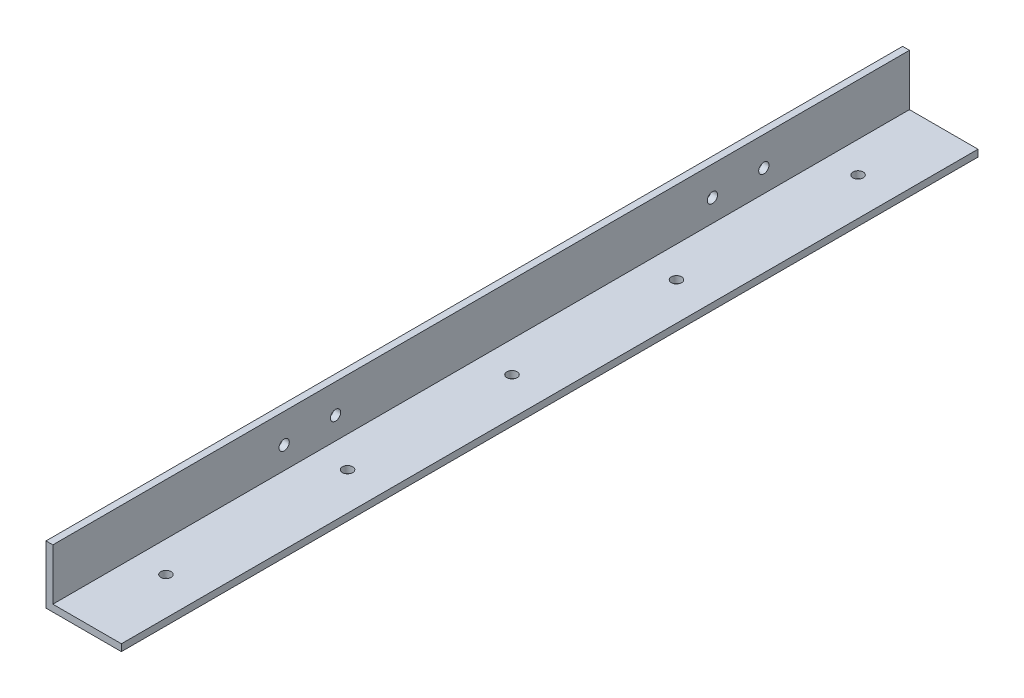
ISO-10303-21;
HEADER;
FILE_DESCRIPTION(('STEP AP214'),'2;1');
FILE_NAME('part.step','',(''),(''),'','','');
FILE_SCHEMA(('AUTOMOTIVE_DESIGN { 1 0 10303 214 1 1 1 1 }'));
ENDSEC;
DATA;
#1=APPLICATION_CONTEXT('core data for automotive mechanical design processes');
#2=APPLICATION_PROTOCOL_DEFINITION('international standard','automotive_design',2000,#1);
#3=PRODUCT_CONTEXT('',#1,'mechanical');
#4=PRODUCT('Part','Part','',(#3));
#5=PRODUCT_RELATED_PRODUCT_CATEGORY('part','',(#4));
#6=PRODUCT_DEFINITION_FORMATION('','',#4);
#7=PRODUCT_DEFINITION_CONTEXT('part definition',#1,'design');
#8=PRODUCT_DEFINITION('design','',#6,#7);
#9=PRODUCT_DEFINITION_SHAPE('','',#8);
#10=(LENGTH_UNIT() NAMED_UNIT(*) SI_UNIT(.MILLI.,.METRE.));
#11=(NAMED_UNIT(*) PLANE_ANGLE_UNIT() SI_UNIT($,.RADIAN.));
#12=(NAMED_UNIT(*) SI_UNIT($,.STERADIAN.) SOLID_ANGLE_UNIT());
#13=UNCERTAINTY_MEASURE_WITH_UNIT(LENGTH_MEASURE(1.E-05),#10,'distance_accuracy_value','');
#14=(GEOMETRIC_REPRESENTATION_CONTEXT(3) GLOBAL_UNCERTAINTY_ASSIGNED_CONTEXT((#13)) GLOBAL_UNIT_ASSIGNED_CONTEXT((#10,
#11,#12)) REPRESENTATION_CONTEXT('',''));
#15=CARTESIAN_POINT('',(0.,0.,0.));
#16=DIRECTION('',(0.,0.,1.));
#17=DIRECTION('',(1.,0.,0.));
#18=AXIS2_PLACEMENT_3D('',#15,#16,#17);
#19=CARTESIAN_POINT('',(0.,0.,-250.));
#20=DIRECTION('',(0.,-1.,0.));
#21=DIRECTION('',(0.,0.,-1.));
#22=AXIS2_PLACEMENT_3D('',#19,#20,#21);
#23=PLANE('',#22);
#24=CARTESIAN_POINT('',(11.,0.,-226.));
#25=DIRECTION('',(0.,-1.,0.));
#26=DIRECTION('',(0.,0.,-1.));
#27=AXIS2_PLACEMENT_3D('',#24,#25,#26);
#28=CIRCLE('',#27,1.5);
#29=CARTESIAN_POINT('',(11.,0.,-227.5));
#30=VERTEX_POINT('',#29);
#31=EDGE_CURVE('E132',#30,#30,#28,.T.);
#32=ORIENTED_EDGE('',*,*,#31,.F.);
#33=EDGE_LOOP('',(#32));
#34=FACE_BOUND('',#33,.T.);
#35=CARTESIAN_POINT('',(11.,0.,-77.));
#36=DIRECTION('',(0.,-1.,0.));
#37=DIRECTION('',(0.,0.,-1.));
#38=AXIS2_PLACEMENT_3D('',#35,#36,#37);
#39=CIRCLE('',#38,1.5);
#40=CARTESIAN_POINT('',(11.,0.,-78.5));
#41=VERTEX_POINT('',#40);
#42=EDGE_CURVE('E189',#41,#41,#39,.T.);
#43=ORIENTED_EDGE('',*,*,#42,.F.);
#44=EDGE_LOOP('',(#43));
#45=FACE_BOUND('',#44,.T.);
#46=CARTESIAN_POINT('',(11.,0.,-173.));
#47=DIRECTION('',(0.,-1.,0.));
#48=DIRECTION('',(0.,0.,-1.));
#49=AXIS2_PLACEMENT_3D('',#46,#47,#48);
#50=CIRCLE('',#49,1.5);
#51=CARTESIAN_POINT('',(11.,0.,-174.5));
#52=VERTEX_POINT('',#51);
#53=EDGE_CURVE('E186',#52,#52,#50,.T.);
#54=ORIENTED_EDGE('',*,*,#53,.F.);
#55=EDGE_LOOP('',(#54));
#56=FACE_BOUND('',#55,.T.);
#57=CARTESIAN_POINT('',(11.,0.,-125.));
#58=DIRECTION('',(0.,-1.,0.));
#59=DIRECTION('',(0.,0.,-1.));
#60=AXIS2_PLACEMENT_3D('',#57,#58,#59);
#61=CIRCLE('',#60,1.5);
#62=CARTESIAN_POINT('',(11.,0.,-126.5));
#63=VERTEX_POINT('',#62);
#64=EDGE_CURVE('E183',#63,#63,#61,.T.);
#65=ORIENTED_EDGE('',*,*,#64,.F.);
#66=EDGE_LOOP('',(#65));
#67=FACE_BOUND('',#66,.T.);
#68=CARTESIAN_POINT('',(11.,0.,-24.));
#69=DIRECTION('',(0.,-1.,0.));
#70=DIRECTION('',(0.,0.,-1.));
#71=AXIS2_PLACEMENT_3D('',#68,#69,#70);
#72=CIRCLE('',#71,1.5);
#73=CARTESIAN_POINT('',(11.,0.,-25.5));
#74=VERTEX_POINT('',#73);
#75=EDGE_CURVE('E180',#74,#74,#72,.T.);
#76=ORIENTED_EDGE('',*,*,#75,.F.);
#77=EDGE_LOOP('',(#76));
#78=FACE_BOUND('',#77,.T.);
#79=DIRECTION('',(1.,0.,0.));
#80=VECTOR('',#79,1.);
#81=CARTESIAN_POINT('',(0.,0.,0.));
#82=LINE('',#81,#80);
#83=CARTESIAN_POINT('',(0.,0.,0.));
#84=VERTEX_POINT('',#83);
#85=CARTESIAN_POINT('',(22.,0.,0.));
#86=VERTEX_POINT('',#85);
#87=EDGE_CURVE('E128',#84,#86,#82,.T.);
#88=ORIENTED_EDGE('',*,*,#87,.F.);
#89=DIRECTION('',(0.,0.,1.));
#90=VECTOR('',#89,1.);
#91=CARTESIAN_POINT('',(0.,0.,-250.));
#92=LINE('',#91,#90);
#93=CARTESIAN_POINT('',(0.,0.,-250.));
#94=VERTEX_POINT('',#93);
#95=EDGE_CURVE('E11',#94,#84,#92,.T.);
#96=ORIENTED_EDGE('',*,*,#95,.F.);
#97=DIRECTION('',(1.,0.,0.));
#98=VECTOR('',#97,1.);
#99=CARTESIAN_POINT('',(0.,0.,-250.));
#100=LINE('',#99,#98);
#101=CARTESIAN_POINT('',(22.,0.,-250.));
#102=VERTEX_POINT('',#101);
#103=EDGE_CURVE('E143',#94,#102,#100,.T.);
#104=ORIENTED_EDGE('',*,*,#103,.T.);
#105=DIRECTION('',(0.,0.,1.));
#106=VECTOR('',#105,1.);
#107=CARTESIAN_POINT('',(22.,0.,-250.));
#108=LINE('',#107,#106);
#109=EDGE_CURVE('E92',#102,#86,#108,.T.);
#110=ORIENTED_EDGE('',*,*,#109,.T.);
#111=EDGE_LOOP('',(#88,#96,#104,#110));
#112=FACE_BOUND('',#111,.T.);
#113=ADVANCED_FACE('F42',(#34,#45,#56,#67,#78,#112),#23,.T.);
#114=CARTESIAN_POINT('',(0.,0.,-250.));
#115=DIRECTION('',(-1.,0.,0.));
#116=DIRECTION('',(0.,0.,1.));
#117=AXIS2_PLACEMENT_3D('',#114,#115,#116);
#118=PLANE('',#117);
#119=CARTESIAN_POINT('',(0.,8.5,-207.5));
#120=DIRECTION('',(-1.,0.,0.));
#121=DIRECTION('',(0.,0.,1.));
#122=AXIS2_PLACEMENT_3D('',#119,#120,#121);
#123=CIRCLE('',#122,1.5);
#124=CARTESIAN_POINT('',(0.,8.5,-206.));
#125=VERTEX_POINT('',#124);
#126=EDGE_CURVE('E154',#125,#125,#123,.T.);
#127=ORIENTED_EDGE('',*,*,#126,.F.);
#128=EDGE_LOOP('',(#127));
#129=FACE_BOUND('',#128,.T.);
#130=CARTESIAN_POINT('',(0.,8.5,-82.5));
#131=DIRECTION('',(-1.,0.,0.));
#132=DIRECTION('',(0.,0.,1.));
#133=AXIS2_PLACEMENT_3D('',#130,#131,#132);
#134=CIRCLE('',#133,1.5);
#135=CARTESIAN_POINT('',(0.,8.5,-81.));
#136=VERTEX_POINT('',#135);
#137=EDGE_CURVE('E270',#136,#136,#134,.T.);
#138=ORIENTED_EDGE('',*,*,#137,.F.);
#139=EDGE_LOOP('',(#138));
#140=FACE_BOUND('',#139,.T.);
#141=CARTESIAN_POINT('',(0.,8.5,-67.5));
#142=DIRECTION('',(-1.,0.,0.));
#143=DIRECTION('',(0.,0.,1.));
#144=AXIS2_PLACEMENT_3D('',#141,#142,#143);
#145=CIRCLE('',#144,1.5);
#146=CARTESIAN_POINT('',(0.,8.5,-66.));
#147=VERTEX_POINT('',#146);
#148=EDGE_CURVE('E267',#147,#147,#145,.T.);
#149=ORIENTED_EDGE('',*,*,#148,.F.);
#150=EDGE_LOOP('',(#149));
#151=FACE_BOUND('',#150,.T.);
#152=CARTESIAN_POINT('',(0.,8.5,-192.5));
#153=DIRECTION('',(-1.,0.,0.));
#154=DIRECTION('',(0.,0.,1.));
#155=AXIS2_PLACEMENT_3D('',#152,#153,#154);
#156=CIRCLE('',#155,1.5);
#157=CARTESIAN_POINT('',(0.,8.5,-191.));
#158=VERTEX_POINT('',#157);
#159=EDGE_CURVE('E264',#158,#158,#156,.T.);
#160=ORIENTED_EDGE('',*,*,#159,.F.);
#161=EDGE_LOOP('',(#160));
#162=FACE_BOUND('',#161,.T.);
#163=DIRECTION('',(0.,-1.,0.));
#164=VECTOR('',#163,1.);
#165=CARTESIAN_POINT('',(0.,0.,0.));
#166=LINE('',#165,#164);
#167=CARTESIAN_POINT('',(0.,17.,0.));
#168=VERTEX_POINT('',#167);
#169=EDGE_CURVE('E141',#168,#84,#166,.T.);
#170=ORIENTED_EDGE('',*,*,#169,.F.);
#171=DIRECTION('',(0.,0.,1.));
#172=VECTOR('',#171,1.);
#173=CARTESIAN_POINT('',(0.,17.,-250.));
#174=LINE('',#173,#172);
#175=CARTESIAN_POINT('',(0.,17.,-250.));
#176=VERTEX_POINT('',#175);
#177=EDGE_CURVE('E51',#176,#168,#174,.T.);
#178=ORIENTED_EDGE('',*,*,#177,.F.);
#179=DIRECTION('',(0.,-1.,0.));
#180=VECTOR('',#179,1.);
#181=CARTESIAN_POINT('',(0.,0.,-250.));
#182=LINE('',#181,#180);
#183=EDGE_CURVE('E118',#176,#94,#182,.T.);
#184=ORIENTED_EDGE('',*,*,#183,.T.);
#185=ORIENTED_EDGE('',*,*,#95,.T.);
#186=EDGE_LOOP('',(#170,#178,#184,#185));
#187=FACE_BOUND('',#186,.T.);
#188=ADVANCED_FACE('F198',(#129,#140,#151,#162,#187),#118,.T.);
#189=CARTESIAN_POINT('',(0.,17.,-250.));
#190=DIRECTION('',(0.,1.,0.));
#191=DIRECTION('',(0.,0.,1.));
#192=AXIS2_PLACEMENT_3D('',#189,#190,#191);
#193=PLANE('',#192);
#194=DIRECTION('',(-1.,0.,0.));
#195=VECTOR('',#194,1.);
#196=CARTESIAN_POINT('',(0.,17.,0.));
#197=LINE('',#196,#195);
#198=CARTESIAN_POINT('',(2.,17.,0.));
#199=VERTEX_POINT('',#198);
#200=EDGE_CURVE('E105',#199,#168,#197,.T.);
#201=ORIENTED_EDGE('',*,*,#200,.F.);
#202=DIRECTION('',(0.,0.,1.));
#203=VECTOR('',#202,1.);
#204=CARTESIAN_POINT('',(2.,17.,-250.));
#205=LINE('',#204,#203);
#206=CARTESIAN_POINT('',(2.,17.,-250.));
#207=VERTEX_POINT('',#206);
#208=EDGE_CURVE('E100',#207,#199,#205,.T.);
#209=ORIENTED_EDGE('',*,*,#208,.F.);
#210=DIRECTION('',(-1.,0.,0.));
#211=VECTOR('',#210,1.);
#212=CARTESIAN_POINT('',(0.,17.,-250.));
#213=LINE('',#212,#211);
#214=EDGE_CURVE('E103',#207,#176,#213,.T.);
#215=ORIENTED_EDGE('',*,*,#214,.T.);
#216=ORIENTED_EDGE('',*,*,#177,.T.);
#217=EDGE_LOOP('',(#201,#209,#215,#216));
#218=FACE_BOUND('',#217,.T.);
#219=ADVANCED_FACE('F102',(#218),#193,.T.);
#220=CARTESIAN_POINT('',(2.,17.,-250.));
#221=DIRECTION('',(1.,0.,0.));
#222=DIRECTION('',(0.,1.,0.));
#223=AXIS2_PLACEMENT_3D('',#220,#221,#222);
#224=PLANE('',#223);
#225=CARTESIAN_POINT('',(2.,8.5,-207.5));
#226=DIRECTION('',(1.,0.,0.));
#227=DIRECTION('',(0.,1.,0.));
#228=AXIS2_PLACEMENT_3D('',#225,#226,#227);
#229=CIRCLE('',#228,1.5);
#230=CARTESIAN_POINT('',(2.,10.,-207.5));
#231=VERTEX_POINT('',#230);
#232=EDGE_CURVE('E45',#231,#231,#229,.T.);
#233=ORIENTED_EDGE('',*,*,#232,.F.);
#234=EDGE_LOOP('',(#233));
#235=FACE_BOUND('',#234,.T.);
#236=CARTESIAN_POINT('',(2.,8.5,-82.5));
#237=DIRECTION('',(1.,0.,0.));
#238=DIRECTION('',(0.,1.,0.));
#239=AXIS2_PLACEMENT_3D('',#236,#237,#238);
#240=CIRCLE('',#239,1.5);
#241=CARTESIAN_POINT('',(2.,10.,-82.5));
#242=VERTEX_POINT('',#241);
#243=EDGE_CURVE('E156',#242,#242,#240,.T.);
#244=ORIENTED_EDGE('',*,*,#243,.F.);
#245=EDGE_LOOP('',(#244));
#246=FACE_BOUND('',#245,.T.);
#247=CARTESIAN_POINT('',(2.,8.5,-67.5));
#248=DIRECTION('',(1.,0.,0.));
#249=DIRECTION('',(0.,1.,0.));
#250=AXIS2_PLACEMENT_3D('',#247,#248,#249);
#251=CIRCLE('',#250,1.5);
#252=CARTESIAN_POINT('',(2.,10.,-67.5));
#253=VERTEX_POINT('',#252);
#254=EDGE_CURVE('E153',#253,#253,#251,.T.);
#255=ORIENTED_EDGE('',*,*,#254,.F.);
#256=EDGE_LOOP('',(#255));
#257=FACE_BOUND('',#256,.T.);
#258=CARTESIAN_POINT('',(2.,8.5,-192.5));
#259=DIRECTION('',(1.,0.,0.));
#260=DIRECTION('',(0.,1.,0.));
#261=AXIS2_PLACEMENT_3D('',#258,#259,#260);
#262=CIRCLE('',#261,1.5);
#263=CARTESIAN_POINT('',(2.,10.,-192.5));
#264=VERTEX_POINT('',#263);
#265=EDGE_CURVE('E150',#264,#264,#262,.T.);
#266=ORIENTED_EDGE('',*,*,#265,.F.);
#267=EDGE_LOOP('',(#266));
#268=FACE_BOUND('',#267,.T.);
#269=DIRECTION('',(0.,1.,0.));
#270=VECTOR('',#269,1.);
#271=CARTESIAN_POINT('',(2.,17.,0.));
#272=LINE('',#271,#270);
#273=CARTESIAN_POINT('',(2.,2.,0.));
#274=VERTEX_POINT('',#273);
#275=EDGE_CURVE('E138',#274,#199,#272,.T.);
#276=ORIENTED_EDGE('',*,*,#275,.F.);
#277=DIRECTION('',(0.,0.,1.));
#278=VECTOR('',#277,1.);
#279=CARTESIAN_POINT('',(2.,2.,-250.));
#280=LINE('',#279,#278);
#281=CARTESIAN_POINT('',(2.,2.,-250.));
#282=VERTEX_POINT('',#281);
#283=EDGE_CURVE('E110',#282,#274,#280,.T.);
#284=ORIENTED_EDGE('',*,*,#283,.F.);
#285=DIRECTION('',(0.,1.,0.));
#286=VECTOR('',#285,1.);
#287=CARTESIAN_POINT('',(2.,17.,-250.));
#288=LINE('',#287,#286);
#289=EDGE_CURVE('E116',#282,#207,#288,.T.);
#290=ORIENTED_EDGE('',*,*,#289,.T.);
#291=ORIENTED_EDGE('',*,*,#208,.T.);
#292=EDGE_LOOP('',(#276,#284,#290,#291));
#293=FACE_BOUND('',#292,.T.);
#294=ADVANCED_FACE('F120',(#235,#246,#257,#268,#293),#224,.T.);
#295=CARTESIAN_POINT('',(2.,2.,-250.));
#296=DIRECTION('',(0.,1.,0.));
#297=DIRECTION('',(0.,0.,1.));
#298=AXIS2_PLACEMENT_3D('',#295,#296,#297);
#299=PLANE('',#298);
#300=CARTESIAN_POINT('',(11.,2.,-226.));
#301=DIRECTION('',(0.,1.,0.));
#302=DIRECTION('',(0.,0.,1.));
#303=AXIS2_PLACEMENT_3D('',#300,#301,#302);
#304=CIRCLE('',#303,1.5);
#305=CARTESIAN_POINT('',(11.,2.,-224.5));
#306=VERTEX_POINT('',#305);
#307=EDGE_CURVE('E177',#306,#306,#304,.T.);
#308=ORIENTED_EDGE('',*,*,#307,.F.);
#309=EDGE_LOOP('',(#308));
#310=FACE_BOUND('',#309,.T.);
#311=CARTESIAN_POINT('',(11.,2.,-77.));
#312=DIRECTION('',(0.,1.,0.));
#313=DIRECTION('',(0.,0.,1.));
#314=AXIS2_PLACEMENT_3D('',#311,#312,#313);
#315=CIRCLE('',#314,1.5);
#316=CARTESIAN_POINT('',(11.,2.,-75.5));
#317=VERTEX_POINT('',#316);
#318=EDGE_CURVE('E161',#317,#317,#315,.T.);
#319=ORIENTED_EDGE('',*,*,#318,.F.);
#320=EDGE_LOOP('',(#319));
#321=FACE_BOUND('',#320,.T.);
#322=CARTESIAN_POINT('',(11.,2.,-173.));
#323=DIRECTION('',(0.,1.,0.));
#324=DIRECTION('',(0.,0.,1.));
#325=AXIS2_PLACEMENT_3D('',#322,#323,#324);
#326=CIRCLE('',#325,1.5);
#327=CARTESIAN_POINT('',(11.,2.,-171.5));
#328=VERTEX_POINT('',#327);
#329=EDGE_CURVE('E165',#328,#328,#326,.T.);
#330=ORIENTED_EDGE('',*,*,#329,.F.);
#331=EDGE_LOOP('',(#330));
#332=FACE_BOUND('',#331,.T.);
#333=CARTESIAN_POINT('',(11.,2.,-125.));
#334=DIRECTION('',(0.,1.,0.));
#335=DIRECTION('',(0.,0.,1.));
#336=AXIS2_PLACEMENT_3D('',#333,#334,#335);
#337=CIRCLE('',#336,1.5);
#338=CARTESIAN_POINT('',(11.,2.,-123.5));
#339=VERTEX_POINT('',#338);
#340=EDGE_CURVE('E170',#339,#339,#337,.T.);
#341=ORIENTED_EDGE('',*,*,#340,.F.);
#342=EDGE_LOOP('',(#341));
#343=FACE_BOUND('',#342,.T.);
#344=CARTESIAN_POINT('',(11.,2.,-24.));
#345=DIRECTION('',(0.,1.,0.));
#346=DIRECTION('',(0.,0.,-1.));
#347=AXIS2_PLACEMENT_3D('',#344,#345,#346);
#348=CIRCLE('',#347,1.5);
#349=CARTESIAN_POINT('',(11.,2.,-25.5));
#350=VERTEX_POINT('',#349);
#351=EDGE_CURVE('E174',#350,#350,#348,.T.);
#352=ORIENTED_EDGE('',*,*,#351,.F.);
#353=EDGE_LOOP('',(#352));
#354=FACE_BOUND('',#353,.T.);
#355=DIRECTION('',(-1.,0.,0.));
#356=VECTOR('',#355,1.);
#357=CARTESIAN_POINT('',(2.,2.,0.));
#358=LINE('',#357,#356);
#359=CARTESIAN_POINT('',(22.,2.,0.));
#360=VERTEX_POINT('',#359);
#361=EDGE_CURVE('E135',#360,#274,#358,.T.);
#362=ORIENTED_EDGE('',*,*,#361,.F.);
#363=DIRECTION('',(0.,0.,1.));
#364=VECTOR('',#363,1.);
#365=CARTESIAN_POINT('',(22.,2.,-250.));
#366=LINE('',#365,#364);
#367=CARTESIAN_POINT('',(22.,2.,-250.));
#368=VERTEX_POINT('',#367);
#369=EDGE_CURVE('E147',#368,#360,#366,.T.);
#370=ORIENTED_EDGE('',*,*,#369,.F.);
#371=DIRECTION('',(-1.,0.,0.));
#372=VECTOR('',#371,1.);
#373=CARTESIAN_POINT('',(2.,2.,-250.));
#374=LINE('',#373,#372);
#375=EDGE_CURVE('E121',#368,#282,#374,.T.);
#376=ORIENTED_EDGE('',*,*,#375,.T.);
#377=ORIENTED_EDGE('',*,*,#283,.T.);
#378=EDGE_LOOP('',(#362,#370,#376,#377));
#379=FACE_BOUND('',#378,.T.);
#380=ADVANCED_FACE('F216',(#310,#321,#332,#343,#354,#379),#299,.T.);
#381=CARTESIAN_POINT('',(22.,2.,-250.));
#382=DIRECTION('',(1.,0.,0.));
#383=DIRECTION('',(0.,0.,-1.));
#384=AXIS2_PLACEMENT_3D('',#381,#382,#383);
#385=PLANE('',#384);
#386=DIRECTION('',(0.,1.,0.));
#387=VECTOR('',#386,1.);
#388=CARTESIAN_POINT('',(22.,2.,0.));
#389=LINE('',#388,#387);
#390=EDGE_CURVE('E131',#86,#360,#389,.T.);
#391=ORIENTED_EDGE('',*,*,#390,.F.);
#392=ORIENTED_EDGE('',*,*,#109,.F.);
#393=DIRECTION('',(0.,1.,0.));
#394=VECTOR('',#393,1.);
#395=CARTESIAN_POINT('',(22.,2.,-250.));
#396=LINE('',#395,#394);
#397=EDGE_CURVE('E123',#102,#368,#396,.T.);
#398=ORIENTED_EDGE('',*,*,#397,.T.);
#399=ORIENTED_EDGE('',*,*,#369,.T.);
#400=EDGE_LOOP('',(#391,#392,#398,#399));
#401=FACE_BOUND('',#400,.T.);
#402=ADVANCED_FACE('F194',(#401),#385,.T.);
#403=CARTESIAN_POINT('',(0.,0.,-250.));
#404=DIRECTION('',(0.,0.,-1.));
#405=DIRECTION('',(-1.,0.,0.));
#406=AXIS2_PLACEMENT_3D('',#403,#404,#405);
#407=PLANE('',#406);
#408=ORIENTED_EDGE('',*,*,#103,.F.);
#409=ORIENTED_EDGE('',*,*,#183,.F.);
#410=ORIENTED_EDGE('',*,*,#214,.F.);
#411=ORIENTED_EDGE('',*,*,#289,.F.);
#412=ORIENTED_EDGE('',*,*,#375,.F.);
#413=ORIENTED_EDGE('',*,*,#397,.F.);
#414=EDGE_LOOP('',(#408,#409,#410,#411,#412,#413));
#415=FACE_BOUND('',#414,.T.);
#416=ADVANCED_FACE('F114',(#415),#407,.T.);
#417=CARTESIAN_POINT('',(0.,0.,0.));
#418=DIRECTION('',(0.,0.,-1.));
#419=DIRECTION('',(-1.,0.,0.));
#420=AXIS2_PLACEMENT_3D('',#417,#418,#419);
#421=PLANE('',#420);
#422=ORIENTED_EDGE('',*,*,#87,.T.);
#423=ORIENTED_EDGE('',*,*,#390,.T.);
#424=ORIENTED_EDGE('',*,*,#361,.T.);
#425=ORIENTED_EDGE('',*,*,#275,.T.);
#426=ORIENTED_EDGE('',*,*,#200,.T.);
#427=ORIENTED_EDGE('',*,*,#169,.T.);
#428=EDGE_LOOP('',(#422,#423,#424,#425,#426,#427));
#429=FACE_BOUND('',#428,.T.);
#430=ADVANCED_FACE('F197',(#429),#421,.F.);
#431=CARTESIAN_POINT('',(11.,-18.,-24.));
#432=DIRECTION('',(0.,1.,0.));
#433=DIRECTION('',(0.,0.,1.));
#434=AXIS2_PLACEMENT_3D('',#431,#432,#433);
#435=CYLINDRICAL_SURFACE('',#434,1.5);
#436=ORIENTED_EDGE('',*,*,#75,.T.);
#437=EDGE_LOOP('',(#436));
#438=FACE_BOUND('',#437,.T.);
#439=ORIENTED_EDGE('',*,*,#351,.T.);
#440=EDGE_LOOP('',(#439));
#441=FACE_BOUND('',#440,.T.);
#442=ADVANCED_FACE('F227',(#438,#441),#435,.F.);
#443=CARTESIAN_POINT('',(11.,-18.,-125.));
#444=DIRECTION('',(0.,1.,0.));
#445=DIRECTION('',(0.,0.,1.));
#446=AXIS2_PLACEMENT_3D('',#443,#444,#445);
#447=CYLINDRICAL_SURFACE('',#446,1.5);
#448=ORIENTED_EDGE('',*,*,#64,.T.);
#449=EDGE_LOOP('',(#448));
#450=FACE_BOUND('',#449,.T.);
#451=ORIENTED_EDGE('',*,*,#340,.T.);
#452=EDGE_LOOP('',(#451));
#453=FACE_BOUND('',#452,.T.);
#454=ADVANCED_FACE('F229',(#450,#453),#447,.F.);
#455=CARTESIAN_POINT('',(11.,-18.,-173.));
#456=DIRECTION('',(0.,1.,0.));
#457=DIRECTION('',(0.,0.,1.));
#458=AXIS2_PLACEMENT_3D('',#455,#456,#457);
#459=CYLINDRICAL_SURFACE('',#458,1.5);
#460=ORIENTED_EDGE('',*,*,#53,.T.);
#461=EDGE_LOOP('',(#460));
#462=FACE_BOUND('',#461,.T.);
#463=ORIENTED_EDGE('',*,*,#329,.T.);
#464=EDGE_LOOP('',(#463));
#465=FACE_BOUND('',#464,.T.);
#466=ADVANCED_FACE('F232',(#462,#465),#459,.F.);
#467=CARTESIAN_POINT('',(11.,-18.,-77.));
#468=DIRECTION('',(0.,1.,0.));
#469=DIRECTION('',(0.,0.,1.));
#470=AXIS2_PLACEMENT_3D('',#467,#468,#469);
#471=CYLINDRICAL_SURFACE('',#470,1.5);
#472=ORIENTED_EDGE('',*,*,#42,.T.);
#473=EDGE_LOOP('',(#472));
#474=FACE_BOUND('',#473,.T.);
#475=ORIENTED_EDGE('',*,*,#318,.T.);
#476=EDGE_LOOP('',(#475));
#477=FACE_BOUND('',#476,.T.);
#478=ADVANCED_FACE('F237',(#474,#477),#471,.F.);
#479=CARTESIAN_POINT('',(11.,-18.,-226.));
#480=DIRECTION('',(0.,1.,0.));
#481=DIRECTION('',(0.,0.,1.));
#482=AXIS2_PLACEMENT_3D('',#479,#480,#481);
#483=CYLINDRICAL_SURFACE('',#482,1.5);
#484=ORIENTED_EDGE('',*,*,#31,.T.);
#485=EDGE_LOOP('',(#484));
#486=FACE_BOUND('',#485,.T.);
#487=ORIENTED_EDGE('',*,*,#307,.T.);
#488=EDGE_LOOP('',(#487));
#489=FACE_BOUND('',#488,.T.);
#490=ADVANCED_FACE('F240',(#486,#489),#483,.F.);
#491=CARTESIAN_POINT('',(10.,8.5,-192.5));
#492=DIRECTION('',(-1.,0.,0.));
#493=DIRECTION('',(0.,0.,1.));
#494=AXIS2_PLACEMENT_3D('',#491,#492,#493);
#495=CYLINDRICAL_SURFACE('',#494,1.5);
#496=ORIENTED_EDGE('',*,*,#265,.T.);
#497=EDGE_LOOP('',(#496));
#498=FACE_BOUND('',#497,.T.);
#499=ORIENTED_EDGE('',*,*,#159,.T.);
#500=EDGE_LOOP('',(#499));
#501=FACE_BOUND('',#500,.T.);
#502=ADVANCED_FACE('F246',(#498,#501),#495,.F.);
#503=CARTESIAN_POINT('',(10.,8.5,-67.5));
#504=DIRECTION('',(-1.,0.,0.));
#505=DIRECTION('',(0.,0.,1.));
#506=AXIS2_PLACEMENT_3D('',#503,#504,#505);
#507=CYLINDRICAL_SURFACE('',#506,1.5);
#508=ORIENTED_EDGE('',*,*,#254,.T.);
#509=EDGE_LOOP('',(#508));
#510=FACE_BOUND('',#509,.T.);
#511=ORIENTED_EDGE('',*,*,#148,.T.);
#512=EDGE_LOOP('',(#511));
#513=FACE_BOUND('',#512,.T.);
#514=ADVANCED_FACE('F248',(#510,#513),#507,.F.);
#515=CARTESIAN_POINT('',(10.,8.5,-82.5));
#516=DIRECTION('',(-1.,0.,0.));
#517=DIRECTION('',(0.,0.,1.));
#518=AXIS2_PLACEMENT_3D('',#515,#516,#517);
#519=CYLINDRICAL_SURFACE('',#518,1.5);
#520=ORIENTED_EDGE('',*,*,#243,.T.);
#521=EDGE_LOOP('',(#520));
#522=FACE_BOUND('',#521,.T.);
#523=ORIENTED_EDGE('',*,*,#137,.T.);
#524=EDGE_LOOP('',(#523));
#525=FACE_BOUND('',#524,.T.);
#526=ADVANCED_FACE('F251',(#522,#525),#519,.F.);
#527=CARTESIAN_POINT('',(10.,8.5,-207.5));
#528=DIRECTION('',(-1.,0.,0.));
#529=DIRECTION('',(0.,0.,1.));
#530=AXIS2_PLACEMENT_3D('',#527,#528,#529);
#531=CYLINDRICAL_SURFACE('',#530,1.5);
#532=ORIENTED_EDGE('',*,*,#232,.T.);
#533=EDGE_LOOP('',(#532));
#534=FACE_BOUND('',#533,.T.);
#535=ORIENTED_EDGE('',*,*,#126,.T.);
#536=EDGE_LOOP('',(#535));
#537=FACE_BOUND('',#536,.T.);
#538=ADVANCED_FACE('F258',(#534,#537),#531,.F.);
#539=CLOSED_SHELL('',(#113,#188,#219,#294,#380,#402,#416,#430,#442,#454,#466,#478,#490,#502,
#514,#526,#538));
#540=MANIFOLD_SOLID_BREP('B2',#539);
#541=ADVANCED_BREP_SHAPE_REPRESENTATION('',(#18,#540),#14);
#542=SHAPE_DEFINITION_REPRESENTATION(#9,#541);
ENDSEC;
END-ISO-10303-21;
